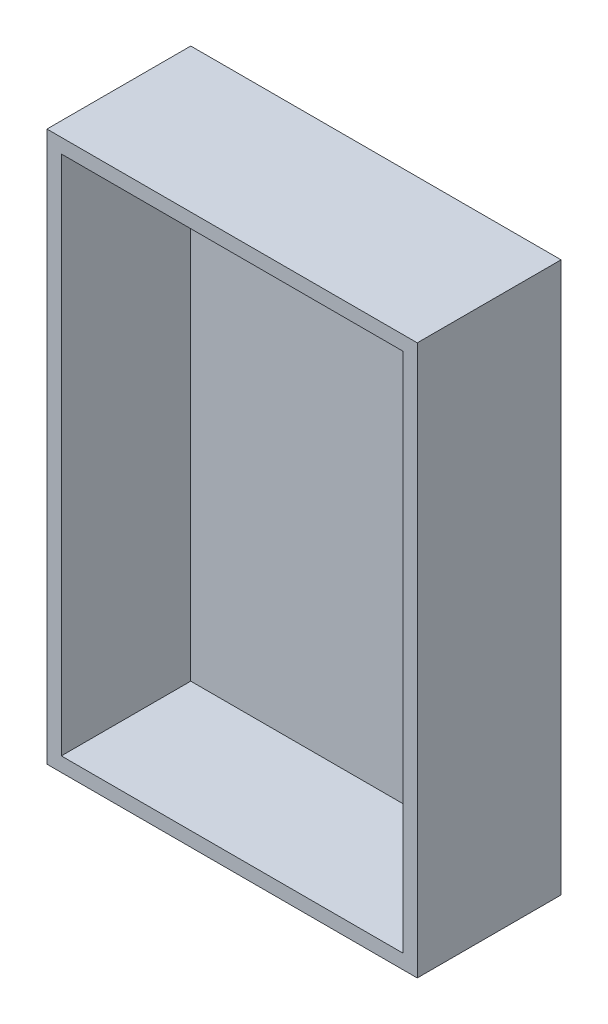
ISO-10303-21;
HEADER;
FILE_DESCRIPTION(('STEP AP214'),'2;1');
FILE_NAME('part.step','',(''),(''),'','','');
FILE_SCHEMA(('AUTOMOTIVE_DESIGN { 1 0 10303 214 1 1 1 1 }'));
ENDSEC;
DATA;
#1=APPLICATION_CONTEXT('core data for automotive mechanical design processes');
#2=APPLICATION_PROTOCOL_DEFINITION('international standard','automotive_design',2000,#1);
#3=PRODUCT_CONTEXT('',#1,'mechanical');
#4=PRODUCT('Part','Part','',(#3));
#5=PRODUCT_RELATED_PRODUCT_CATEGORY('part','',(#4));
#6=PRODUCT_DEFINITION_FORMATION('','',#4);
#7=PRODUCT_DEFINITION_CONTEXT('part definition',#1,'design');
#8=PRODUCT_DEFINITION('design','',#6,#7);
#9=PRODUCT_DEFINITION_SHAPE('','',#8);
#10=(LENGTH_UNIT() NAMED_UNIT(*) SI_UNIT(.MILLI.,.METRE.));
#11=(NAMED_UNIT(*) PLANE_ANGLE_UNIT() SI_UNIT($,.RADIAN.));
#12=(NAMED_UNIT(*) SI_UNIT($,.STERADIAN.) SOLID_ANGLE_UNIT());
#13=UNCERTAINTY_MEASURE_WITH_UNIT(LENGTH_MEASURE(1.E-05),#10,'distance_accuracy_value','');
#14=(GEOMETRIC_REPRESENTATION_CONTEXT(3) GLOBAL_UNCERTAINTY_ASSIGNED_CONTEXT((#13)) GLOBAL_UNIT_ASSIGNED_CONTEXT((#10,
#11,#12)) REPRESENTATION_CONTEXT('',''));
#15=CARTESIAN_POINT('',(0.,0.,0.));
#16=DIRECTION('',(0.,0.,1.));
#17=DIRECTION('',(1.,0.,0.));
#18=AXIS2_PLACEMENT_3D('',#15,#16,#17);
#19=CARTESIAN_POINT('',(0.,0.,2.54));
#20=DIRECTION('',(0.,0.,1.));
#21=DIRECTION('',(1.,0.,0.));
#22=AXIS2_PLACEMENT_3D('',#19,#20,#21);
#23=PLANE('',#22);
#24=DIRECTION('',(1.,0.,0.));
#25=VECTOR('',#24,1.);
#26=CARTESIAN_POINT('',(-32.7025,-46.0375,2.54));
#27=LINE('',#26,#25);
#28=CARTESIAN_POINT('',(-30.1625,-46.0375,2.54));
#29=VERTEX_POINT('',#28);
#30=CARTESIAN_POINT('',(30.1625,-46.0375,2.54));
#31=VERTEX_POINT('',#30);
#32=EDGE_CURVE('E69',#29,#31,#27,.T.);
#33=ORIENTED_EDGE('',*,*,#32,.T.);
#34=DIRECTION('',(0.,1.,0.));
#35=VECTOR('',#34,1.);
#36=CARTESIAN_POINT('',(30.1625,-48.5775,2.54));
#37=LINE('',#36,#35);
#38=CARTESIAN_POINT('',(30.1625,46.0375,2.54));
#39=VERTEX_POINT('',#38);
#40=EDGE_CURVE('E98',#31,#39,#37,.T.);
#41=ORIENTED_EDGE('',*,*,#40,.T.);
#42=DIRECTION('',(-1.,0.,0.));
#43=VECTOR('',#42,1.);
#44=CARTESIAN_POINT('',(-32.7025,46.0375,2.54));
#45=LINE('',#44,#43);
#46=CARTESIAN_POINT('',(-30.1625,46.0375,2.54));
#47=VERTEX_POINT('',#46);
#48=EDGE_CURVE('E51',#39,#47,#45,.T.);
#49=ORIENTED_EDGE('',*,*,#48,.T.);
#50=DIRECTION('',(0.,-1.,0.));
#51=VECTOR('',#50,1.);
#52=CARTESIAN_POINT('',(-30.1625,-48.5775,2.54));
#53=LINE('',#52,#51);
#54=EDGE_CURVE('E11',#47,#29,#53,.T.);
#55=ORIENTED_EDGE('',*,*,#54,.T.);
#56=EDGE_LOOP('',(#33,#41,#49,#55));
#57=FACE_BOUND('',#56,.T.);
#58=ADVANCED_FACE('F17',(#57),#23,.T.);
#59=CARTESIAN_POINT('',(-30.1625,-48.5775,25.4));
#60=DIRECTION('',(1.,0.,0.));
#61=DIRECTION('',(0.,1.,0.));
#62=AXIS2_PLACEMENT_3D('',#59,#60,#61);
#63=PLANE('',#62);
#64=ORIENTED_EDGE('',*,*,#54,.F.);
#65=DIRECTION('',(0.,0.,-1.));
#66=VECTOR('',#65,1.);
#67=CARTESIAN_POINT('',(-30.1625,46.0375,25.4));
#68=LINE('',#67,#66);
#69=CARTESIAN_POINT('',(-30.1625,46.0375,25.4));
#70=VERTEX_POINT('',#69);
#71=EDGE_CURVE('E21',#70,#47,#68,.T.);
#72=ORIENTED_EDGE('',*,*,#71,.F.);
#73=DIRECTION('',(0.,-1.,0.));
#74=VECTOR('',#73,1.);
#75=CARTESIAN_POINT('',(-30.1625,-48.5775,25.4));
#76=LINE('',#75,#74);
#77=CARTESIAN_POINT('',(-30.1625,-46.0375,25.4));
#78=VERTEX_POINT('',#77);
#79=EDGE_CURVE('E75',#70,#78,#76,.T.);
#80=ORIENTED_EDGE('',*,*,#79,.T.);
#81=DIRECTION('',(0.,0.,-1.));
#82=VECTOR('',#81,1.);
#83=CARTESIAN_POINT('',(-30.1625,-46.0375,25.4));
#84=LINE('',#83,#82);
#85=EDGE_CURVE('E72',#78,#29,#84,.T.);
#86=ORIENTED_EDGE('',*,*,#85,.T.);
#87=EDGE_LOOP('',(#64,#72,#80,#86));
#88=FACE_BOUND('',#87,.T.);
#89=ADVANCED_FACE('F19',(#88),#63,.T.);
#90=CARTESIAN_POINT('',(-32.7025,46.0375,25.4));
#91=DIRECTION('',(0.,-1.,0.));
#92=DIRECTION('',(0.,0.,-1.));
#93=AXIS2_PLACEMENT_3D('',#90,#91,#92);
#94=PLANE('',#93);
#95=ORIENTED_EDGE('',*,*,#48,.F.);
#96=DIRECTION('',(0.,0.,-1.));
#97=VECTOR('',#96,1.);
#98=CARTESIAN_POINT('',(30.1625,46.0375,25.4));
#99=LINE('',#98,#97);
#100=CARTESIAN_POINT('',(30.1625,46.0375,25.4));
#101=VERTEX_POINT('',#100);
#102=EDGE_CURVE('E102',#101,#39,#99,.T.);
#103=ORIENTED_EDGE('',*,*,#102,.F.);
#104=DIRECTION('',(-1.,0.,0.));
#105=VECTOR('',#104,1.);
#106=CARTESIAN_POINT('',(-32.7025,46.0375,25.4));
#107=LINE('',#106,#105);
#108=EDGE_CURVE('E93',#101,#70,#107,.T.);
#109=ORIENTED_EDGE('',*,*,#108,.T.);
#110=ORIENTED_EDGE('',*,*,#71,.T.);
#111=EDGE_LOOP('',(#95,#103,#109,#110));
#112=FACE_BOUND('',#111,.T.);
#113=ADVANCED_FACE('F167',(#112),#94,.T.);
#114=CARTESIAN_POINT('',(30.1625,-48.5775,25.4));
#115=DIRECTION('',(-1.,0.,0.));
#116=DIRECTION('',(0.,1.,0.));
#117=AXIS2_PLACEMENT_3D('',#114,#115,#116);
#118=PLANE('',#117);
#119=ORIENTED_EDGE('',*,*,#40,.F.);
#120=DIRECTION('',(0.,0.,-1.));
#121=VECTOR('',#120,1.);
#122=CARTESIAN_POINT('',(30.1625,-46.0375,25.4));
#123=LINE('',#122,#121);
#124=CARTESIAN_POINT('',(30.1625,-46.0375,25.4));
#125=VERTEX_POINT('',#124);
#126=EDGE_CURVE('E80',#125,#31,#123,.T.);
#127=ORIENTED_EDGE('',*,*,#126,.F.);
#128=DIRECTION('',(0.,1.,0.));
#129=VECTOR('',#128,1.);
#130=CARTESIAN_POINT('',(30.1625,-48.5775,25.4));
#131=LINE('',#130,#129);
#132=EDGE_CURVE('E86',#125,#101,#131,.T.);
#133=ORIENTED_EDGE('',*,*,#132,.T.);
#134=ORIENTED_EDGE('',*,*,#102,.T.);
#135=EDGE_LOOP('',(#119,#127,#133,#134));
#136=FACE_BOUND('',#135,.T.);
#137=ADVANCED_FACE('F181',(#136),#118,.T.);
#138=CARTESIAN_POINT('',(-32.7025,-46.0375,25.4));
#139=DIRECTION('',(0.,1.,0.));
#140=DIRECTION('',(1.,0.,0.));
#141=AXIS2_PLACEMENT_3D('',#138,#139,#140);
#142=PLANE('',#141);
#143=ORIENTED_EDGE('',*,*,#32,.F.);
#144=ORIENTED_EDGE('',*,*,#85,.F.);
#145=DIRECTION('',(1.,0.,0.));
#146=VECTOR('',#145,1.);
#147=CARTESIAN_POINT('',(-32.7025,-46.0375,25.4));
#148=LINE('',#147,#146);
#149=EDGE_CURVE('E131',#78,#125,#148,.T.);
#150=ORIENTED_EDGE('',*,*,#149,.T.);
#151=ORIENTED_EDGE('',*,*,#126,.T.);
#152=EDGE_LOOP('',(#143,#144,#150,#151));
#153=FACE_BOUND('',#152,.T.);
#154=ADVANCED_FACE('F83',(#153),#142,.T.);
#155=CARTESIAN_POINT('',(0.,0.,0.));
#156=DIRECTION('',(0.,0.,1.));
#157=DIRECTION('',(1.,0.,0.));
#158=AXIS2_PLACEMENT_3D('',#155,#156,#157);
#159=PLANE('',#158);
#160=DIRECTION('',(1.,0.,0.));
#161=VECTOR('',#160,1.);
#162=CARTESIAN_POINT('',(-32.7025,-48.5775,0.));
#163=LINE('',#162,#161);
#164=CARTESIAN_POINT('',(-32.7025,-48.5775,0.));
#165=VERTEX_POINT('',#164);
#166=CARTESIAN_POINT('',(32.7025,-48.5775,0.));
#167=VERTEX_POINT('',#166);
#168=EDGE_CURVE('E121',#165,#167,#163,.T.);
#169=ORIENTED_EDGE('',*,*,#168,.F.);
#170=DIRECTION('',(0.,-1.,0.));
#171=VECTOR('',#170,1.);
#172=CARTESIAN_POINT('',(-32.7025,-48.5775,0.));
#173=LINE('',#172,#171);
#174=CARTESIAN_POINT('',(-32.7025,48.5775,0.));
#175=VERTEX_POINT('',#174);
#176=EDGE_CURVE('E132',#175,#165,#173,.T.);
#177=ORIENTED_EDGE('',*,*,#176,.F.);
#178=DIRECTION('',(-1.,0.,0.));
#179=VECTOR('',#178,1.);
#180=CARTESIAN_POINT('',(-32.7025,48.5775,0.));
#181=LINE('',#180,#179);
#182=CARTESIAN_POINT('',(32.7025,48.5775,0.));
#183=VERTEX_POINT('',#182);
#184=EDGE_CURVE('E144',#183,#175,#181,.T.);
#185=ORIENTED_EDGE('',*,*,#184,.F.);
#186=DIRECTION('',(0.,1.,0.));
#187=VECTOR('',#186,1.);
#188=CARTESIAN_POINT('',(32.7025,-48.5775,0.));
#189=LINE('',#188,#187);
#190=EDGE_CURVE('E110',#167,#183,#189,.T.);
#191=ORIENTED_EDGE('',*,*,#190,.F.);
#192=EDGE_LOOP('',(#169,#177,#185,#191));
#193=FACE_BOUND('',#192,.T.);
#194=ADVANCED_FACE('F189',(#193),#159,.F.);
#195=CARTESIAN_POINT('',(0.,0.,25.4));
#196=DIRECTION('',(0.,0.,1.));
#197=DIRECTION('',(1.,0.,0.));
#198=AXIS2_PLACEMENT_3D('',#195,#196,#197);
#199=PLANE('',#198);
#200=ORIENTED_EDGE('',*,*,#149,.F.);
#201=ORIENTED_EDGE('',*,*,#79,.F.);
#202=ORIENTED_EDGE('',*,*,#108,.F.);
#203=ORIENTED_EDGE('',*,*,#132,.F.);
#204=EDGE_LOOP('',(#200,#201,#202,#203));
#205=FACE_BOUND('',#204,.T.);
#206=DIRECTION('',(1.,0.,0.));
#207=VECTOR('',#206,1.);
#208=CARTESIAN_POINT('',(-32.7025,-48.5775,25.4));
#209=LINE('',#208,#207);
#210=CARTESIAN_POINT('',(-32.7025,-48.5775,25.4));
#211=VERTEX_POINT('',#210);
#212=CARTESIAN_POINT('',(32.7025,-48.5775,25.4));
#213=VERTEX_POINT('',#212);
#214=EDGE_CURVE('E116',#211,#213,#209,.T.);
#215=ORIENTED_EDGE('',*,*,#214,.T.);
#216=DIRECTION('',(0.,1.,0.));
#217=VECTOR('',#216,1.);
#218=CARTESIAN_POINT('',(32.7025,-48.5775,25.4));
#219=LINE('',#218,#217);
#220=CARTESIAN_POINT('',(32.7025,48.5775,25.4));
#221=VERTEX_POINT('',#220);
#222=EDGE_CURVE('E109',#213,#221,#219,.T.);
#223=ORIENTED_EDGE('',*,*,#222,.T.);
#224=DIRECTION('',(-1.,0.,0.));
#225=VECTOR('',#224,1.);
#226=CARTESIAN_POINT('',(-32.7025,48.5775,25.4));
#227=LINE('',#226,#225);
#228=CARTESIAN_POINT('',(-32.7025,48.5775,25.4));
#229=VERTEX_POINT('',#228);
#230=EDGE_CURVE('E152',#221,#229,#227,.T.);
#231=ORIENTED_EDGE('',*,*,#230,.T.);
#232=DIRECTION('',(0.,-1.,0.));
#233=VECTOR('',#232,1.);
#234=CARTESIAN_POINT('',(-32.7025,-48.5775,25.4));
#235=LINE('',#234,#233);
#236=EDGE_CURVE('E128',#229,#211,#235,.T.);
#237=ORIENTED_EDGE('',*,*,#236,.T.);
#238=EDGE_LOOP('',(#215,#223,#231,#237));
#239=FACE_BOUND('',#238,.T.);
#240=ADVANCED_FACE('F172',(#205,#239),#199,.T.);
#241=CARTESIAN_POINT('',(-32.7025,-48.5775,25.4));
#242=DIRECTION('',(1.,0.,0.));
#243=DIRECTION('',(0.,1.,0.));
#244=AXIS2_PLACEMENT_3D('',#241,#242,#243);
#245=PLANE('',#244);
#246=ORIENTED_EDGE('',*,*,#176,.T.);
#247=DIRECTION('',(0.,0.,-1.));
#248=VECTOR('',#247,1.);
#249=CARTESIAN_POINT('',(-32.7025,-48.5775,25.4));
#250=LINE('',#249,#248);
#251=EDGE_CURVE('E114',#211,#165,#250,.T.);
#252=ORIENTED_EDGE('',*,*,#251,.F.);
#253=ORIENTED_EDGE('',*,*,#236,.F.);
#254=DIRECTION('',(0.,0.,-1.));
#255=VECTOR('',#254,1.);
#256=CARTESIAN_POINT('',(-32.7025,48.5775,25.4));
#257=LINE('',#256,#255);
#258=EDGE_CURVE('E148',#229,#175,#257,.T.);
#259=ORIENTED_EDGE('',*,*,#258,.T.);
#260=EDGE_LOOP('',(#246,#252,#253,#259));
#261=FACE_BOUND('',#260,.T.);
#262=ADVANCED_FACE('F242',(#261),#245,.F.);
#263=CARTESIAN_POINT('',(-32.7025,48.5775,25.4));
#264=DIRECTION('',(0.,-1.,0.));
#265=DIRECTION('',(0.,0.,-1.));
#266=AXIS2_PLACEMENT_3D('',#263,#264,#265);
#267=PLANE('',#266);
#268=ORIENTED_EDGE('',*,*,#184,.T.);
#269=ORIENTED_EDGE('',*,*,#258,.F.);
#270=ORIENTED_EDGE('',*,*,#230,.F.);
#271=DIRECTION('',(0.,0.,-1.));
#272=VECTOR('',#271,1.);
#273=CARTESIAN_POINT('',(32.7025,48.5775,25.4));
#274=LINE('',#273,#272);
#275=EDGE_CURVE('E113',#221,#183,#274,.T.);
#276=ORIENTED_EDGE('',*,*,#275,.T.);
#277=EDGE_LOOP('',(#268,#269,#270,#276));
#278=FACE_BOUND('',#277,.T.);
#279=ADVANCED_FACE('F252',(#278),#267,.F.);
#280=CARTESIAN_POINT('',(32.7025,-48.5775,25.4));
#281=DIRECTION('',(-1.,0.,0.));
#282=DIRECTION('',(0.,1.,0.));
#283=AXIS2_PLACEMENT_3D('',#280,#281,#282);
#284=PLANE('',#283);
#285=ORIENTED_EDGE('',*,*,#190,.T.);
#286=ORIENTED_EDGE('',*,*,#275,.F.);
#287=ORIENTED_EDGE('',*,*,#222,.F.);
#288=DIRECTION('',(0.,0.,-1.));
#289=VECTOR('',#288,1.);
#290=CARTESIAN_POINT('',(32.7025,-48.5775,25.4));
#291=LINE('',#290,#289);
#292=EDGE_CURVE('E120',#213,#167,#291,.T.);
#293=ORIENTED_EDGE('',*,*,#292,.T.);
#294=EDGE_LOOP('',(#285,#286,#287,#293));
#295=FACE_BOUND('',#294,.T.);
#296=ADVANCED_FACE('F263',(#295),#284,.F.);
#297=CARTESIAN_POINT('',(-32.7025,-48.5775,25.4));
#298=DIRECTION('',(0.,1.,0.));
#299=DIRECTION('',(1.,0.,0.));
#300=AXIS2_PLACEMENT_3D('',#297,#298,#299);
#301=PLANE('',#300);
#302=ORIENTED_EDGE('',*,*,#168,.T.);
#303=ORIENTED_EDGE('',*,*,#292,.F.);
#304=ORIENTED_EDGE('',*,*,#214,.F.);
#305=ORIENTED_EDGE('',*,*,#251,.T.);
#306=EDGE_LOOP('',(#302,#303,#304,#305));
#307=FACE_BOUND('',#306,.T.);
#308=ADVANCED_FACE('F274',(#307),#301,.F.);
#309=CLOSED_SHELL('',(#58,#89,#113,#137,#154,#194,#240,#262,#279,#296,#308));
#310=MANIFOLD_SOLID_BREP('B1',#309);
#311=ADVANCED_BREP_SHAPE_REPRESENTATION('',(#18,#310),#14);
#312=SHAPE_DEFINITION_REPRESENTATION(#9,#311);
ENDSEC;
END-ISO-10303-21;
